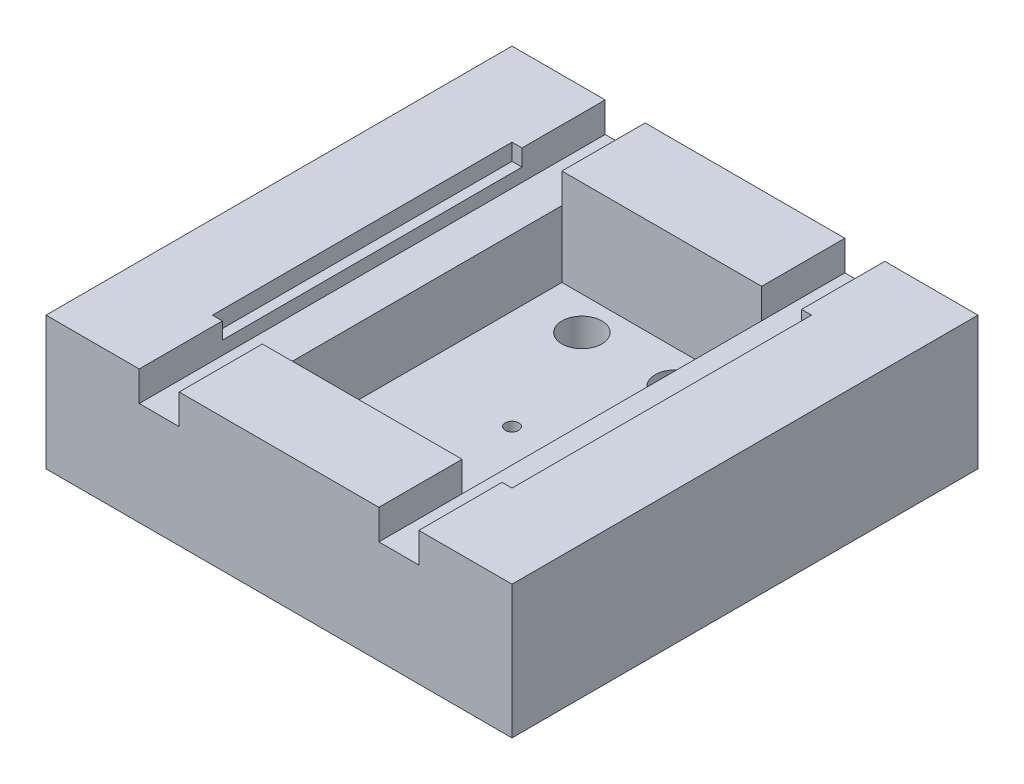
ISO-10303-21;
HEADER;
FILE_DESCRIPTION(('STEP AP214'),'2;1');
FILE_NAME('part.step','',(''),(''),'','','');
FILE_SCHEMA(('AUTOMOTIVE_DESIGN { 1 0 10303 214 1 1 1 1 }'));
ENDSEC;
DATA;
#1=APPLICATION_CONTEXT('core data for automotive mechanical design processes');
#2=APPLICATION_PROTOCOL_DEFINITION('international standard','automotive_design',2000,#1);
#3=PRODUCT_CONTEXT('',#1,'mechanical');
#4=PRODUCT('Part','Part','',(#3));
#5=PRODUCT_RELATED_PRODUCT_CATEGORY('part','',(#4));
#6=PRODUCT_DEFINITION_FORMATION('','',#4);
#7=PRODUCT_DEFINITION_CONTEXT('part definition',#1,'design');
#8=PRODUCT_DEFINITION('design','',#6,#7);
#9=PRODUCT_DEFINITION_SHAPE('','',#8);
#10=(LENGTH_UNIT() NAMED_UNIT(*) SI_UNIT(.MILLI.,.METRE.));
#11=(NAMED_UNIT(*) PLANE_ANGLE_UNIT() SI_UNIT($,.RADIAN.));
#12=(NAMED_UNIT(*) SI_UNIT($,.STERADIAN.) SOLID_ANGLE_UNIT());
#13=UNCERTAINTY_MEASURE_WITH_UNIT(LENGTH_MEASURE(1.E-05),#10,'distance_accuracy_value','');
#14=(GEOMETRIC_REPRESENTATION_CONTEXT(3) GLOBAL_UNCERTAINTY_ASSIGNED_CONTEXT((#13)) GLOBAL_UNIT_ASSIGNED_CONTEXT((#10,
#11,#12)) REPRESENTATION_CONTEXT('',''));
#15=CARTESIAN_POINT('',(0.,0.,0.));
#16=DIRECTION('',(0.,0.,1.));
#17=DIRECTION('',(1.,0.,0.));
#18=AXIS2_PLACEMENT_3D('',#15,#16,#17);
#19=CARTESIAN_POINT('',(20.,30.,0.));
#20=DIRECTION('',(-1.,0.,0.));
#21=DIRECTION('',(0.,0.,1.));
#22=AXIS2_PLACEMENT_3D('',#19,#20,#21);
#23=PLANE('',#22);
#24=DIRECTION('',(0.,0.,-1.));
#25=VECTOR('',#24,1.);
#26=CARTESIAN_POINT('',(20.,15.5,0.));
#27=LINE('',#26,#25);
#28=CARTESIAN_POINT('',(20.,15.5,-57.5));
#29=VERTEX_POINT('',#28);
#30=CARTESIAN_POINT('',(20.,15.5,-70.));
#31=VERTEX_POINT('',#30);
#32=EDGE_CURVE('E241',#29,#31,#27,.T.);
#33=ORIENTED_EDGE('',*,*,#32,.F.);
#34=DIRECTION('',(0.,1.,0.));
#35=VECTOR('',#34,1.);
#36=CARTESIAN_POINT('',(20.,17.5,-57.5));
#37=LINE('',#36,#35);
#38=CARTESIAN_POINT('',(20.,20.,-57.5));
#39=VERTEX_POINT('',#38);
#40=EDGE_CURVE('E302',#29,#39,#37,.T.);
#41=ORIENTED_EDGE('',*,*,#40,.T.);
#42=DIRECTION('',(0.,0.,-1.));
#43=VECTOR('',#42,1.);
#44=CARTESIAN_POINT('',(20.,20.,0.));
#45=LINE('',#44,#43);
#46=CARTESIAN_POINT('',(20.,20.,-70.));
#47=VERTEX_POINT('',#46);
#48=EDGE_CURVE('E304',#39,#47,#45,.T.);
#49=ORIENTED_EDGE('',*,*,#48,.T.);
#50=DIRECTION('',(0.,-1.,0.));
#51=VECTOR('',#50,1.);
#52=CARTESIAN_POINT('',(20.,30.,-70.));
#53=LINE('',#52,#51);
#54=EDGE_CURVE('E291',#47,#31,#53,.T.);
#55=ORIENTED_EDGE('',*,*,#54,.T.);
#56=EDGE_LOOP('',(#33,#41,#49,#55));
#57=FACE_BOUND('',#56,.T.);
#58=ADVANCED_FACE('F33',(#57),#23,.T.);
#59=CARTESIAN_POINT('',(50.,30.,0.));
#60=DIRECTION('',(1.,0.,0.));
#61=DIRECTION('',(0.,0.,-1.));
#62=AXIS2_PLACEMENT_3D('',#59,#60,#61);
#63=PLANE('',#62);
#64=DIRECTION('',(0.,-1.,0.));
#65=VECTOR('',#64,1.);
#66=CARTESIAN_POINT('',(50.,17.5,-57.5));
#67=LINE('',#66,#65);
#68=CARTESIAN_POINT('',(50.,20.,-57.5));
#69=VERTEX_POINT('',#68);
#70=CARTESIAN_POINT('',(50.,15.5,-57.5));
#71=VERTEX_POINT('',#70);
#72=EDGE_CURVE('E314',#69,#71,#67,.T.);
#73=ORIENTED_EDGE('',*,*,#72,.T.);
#74=DIRECTION('',(0.,0.,1.));
#75=VECTOR('',#74,1.);
#76=CARTESIAN_POINT('',(50.,15.5,0.));
#77=LINE('',#76,#75);
#78=CARTESIAN_POINT('',(50.,15.5,-70.));
#79=VERTEX_POINT('',#78);
#80=EDGE_CURVE('E246',#79,#71,#77,.T.);
#81=ORIENTED_EDGE('',*,*,#80,.F.);
#82=DIRECTION('',(0.,-1.,0.));
#83=VECTOR('',#82,1.);
#84=CARTESIAN_POINT('',(50.,30.,-70.));
#85=LINE('',#84,#83);
#86=CARTESIAN_POINT('',(50.,20.,-70.));
#87=VERTEX_POINT('',#86);
#88=EDGE_CURVE('E260',#87,#79,#85,.T.);
#89=ORIENTED_EDGE('',*,*,#88,.F.);
#90=DIRECTION('',(0.,0.,1.));
#91=VECTOR('',#90,1.);
#92=CARTESIAN_POINT('',(50.,20.,0.));
#93=LINE('',#92,#91);
#94=EDGE_CURVE('E318',#87,#69,#93,.T.);
#95=ORIENTED_EDGE('',*,*,#94,.T.);
#96=EDGE_LOOP('',(#73,#81,#89,#95));
#97=FACE_BOUND('',#96,.T.);
#98=ADVANCED_FACE('F438',(#97),#63,.T.);
#99=CARTESIAN_POINT('',(0.,20.,0.));
#100=DIRECTION('',(0.,0.,-1.));
#101=DIRECTION('',(-1.,0.,0.));
#102=AXIS2_PLACEMENT_3D('',#99,#100,#101);
#103=PLANE('',#102);
#104=DIRECTION('',(0.,-1.,0.));
#105=VECTOR('',#104,1.);
#106=CARTESIAN_POINT('',(50.,30.,0.));
#107=LINE('',#106,#105);
#108=CARTESIAN_POINT('',(50.,20.,0.));
#109=VERTEX_POINT('',#108);
#110=CARTESIAN_POINT('',(50.,15.5,0.));
#111=VERTEX_POINT('',#110);
#112=EDGE_CURVE('E268',#109,#111,#107,.T.);
#113=ORIENTED_EDGE('',*,*,#112,.F.);
#114=DIRECTION('',(1.,0.,0.));
#115=VECTOR('',#114,1.);
#116=CARTESIAN_POINT('',(0.,20.,0.));
#117=LINE('',#116,#115);
#118=CARTESIAN_POINT('',(20.,20.,0.));
#119=VERTEX_POINT('',#118);
#120=EDGE_CURVE('E369',#119,#109,#117,.T.);
#121=ORIENTED_EDGE('',*,*,#120,.F.);
#122=DIRECTION('',(0.,-1.,0.));
#123=VECTOR('',#122,1.);
#124=CARTESIAN_POINT('',(20.,30.,0.));
#125=LINE('',#124,#123);
#126=CARTESIAN_POINT('',(20.,15.5,0.));
#127=VERTEX_POINT('',#126);
#128=EDGE_CURVE('E283',#119,#127,#125,.T.);
#129=ORIENTED_EDGE('',*,*,#128,.T.);
#130=DIRECTION('',(1.,0.,0.));
#131=VECTOR('',#130,1.);
#132=CARTESIAN_POINT('',(20.,15.5,0.));
#133=LINE('',#132,#131);
#134=CARTESIAN_POINT('',(14.,15.5,0.));
#135=VERTEX_POINT('',#134);
#136=EDGE_CURVE('E280',#135,#127,#133,.T.);
#137=ORIENTED_EDGE('',*,*,#136,.F.);
#138=DIRECTION('',(0.,-1.,0.));
#139=VECTOR('',#138,1.);
#140=CARTESIAN_POINT('',(14.,30.,0.));
#141=LINE('',#140,#139);
#142=CARTESIAN_POINT('',(14.,20.,0.));
#143=VERTEX_POINT('',#142);
#144=EDGE_CURVE('E286',#143,#135,#141,.T.);
#145=ORIENTED_EDGE('',*,*,#144,.F.);
#146=CARTESIAN_POINT('',(0.,20.,0.));
#147=VERTEX_POINT('',#146);
#148=EDGE_CURVE('E365',#147,#143,#117,.T.);
#149=ORIENTED_EDGE('',*,*,#148,.F.);
#150=DIRECTION('',(0.,-1.,0.));
#151=VECTOR('',#150,1.);
#152=CARTESIAN_POINT('',(0.,20.,0.));
#153=LINE('',#152,#151);
#154=CARTESIAN_POINT('',(0.,0.,0.));
#155=VERTEX_POINT('',#154);
#156=EDGE_CURVE('E392',#147,#155,#153,.T.);
#157=ORIENTED_EDGE('',*,*,#156,.T.);
#158=DIRECTION('',(1.,0.,0.));
#159=VECTOR('',#158,1.);
#160=CARTESIAN_POINT('',(0.,0.,0.));
#161=LINE('',#160,#159);
#162=CARTESIAN_POINT('',(70.,0.,0.));
#163=VERTEX_POINT('',#162);
#164=EDGE_CURVE('E379',#155,#163,#161,.T.);
#165=ORIENTED_EDGE('',*,*,#164,.T.);
#166=DIRECTION('',(0.,-1.,0.));
#167=VECTOR('',#166,1.);
#168=CARTESIAN_POINT('',(70.,20.,0.));
#169=LINE('',#168,#167);
#170=CARTESIAN_POINT('',(70.,20.,0.));
#171=VERTEX_POINT('',#170);
#172=EDGE_CURVE('E389',#171,#163,#169,.T.);
#173=ORIENTED_EDGE('',*,*,#172,.F.);
#174=CARTESIAN_POINT('',(56.,20.,0.));
#175=VERTEX_POINT('',#174);
#176=EDGE_CURVE('E363',#175,#171,#117,.T.);
#177=ORIENTED_EDGE('',*,*,#176,.F.);
#178=DIRECTION('',(0.,-1.,0.));
#179=VECTOR('',#178,1.);
#180=CARTESIAN_POINT('',(56.,30.,0.));
#181=LINE('',#180,#179);
#182=CARTESIAN_POINT('',(56.,15.5,0.));
#183=VERTEX_POINT('',#182);
#184=EDGE_CURVE('E265',#175,#183,#181,.T.);
#185=ORIENTED_EDGE('',*,*,#184,.T.);
#186=DIRECTION('',(1.,0.,0.));
#187=VECTOR('',#186,1.);
#188=CARTESIAN_POINT('',(50.,15.5,0.));
#189=LINE('',#188,#187);
#190=EDGE_CURVE('E249',#111,#183,#189,.T.);
#191=ORIENTED_EDGE('',*,*,#190,.F.);
#192=EDGE_LOOP('',(#113,#121,#129,#137,#145,#149,#157,#165,#173,#177,#185,#191));
#193=FACE_BOUND('',#192,.T.);
#194=ADVANCED_FACE('F423',(#193),#103,.F.);
#195=CARTESIAN_POINT('',(0.,20.,-70.));
#196=DIRECTION('',(0.,0.,1.));
#197=DIRECTION('',(1.,0.,0.));
#198=AXIS2_PLACEMENT_3D('',#195,#196,#197);
#199=PLANE('',#198);
#200=ORIENTED_EDGE('',*,*,#88,.T.);
#201=DIRECTION('',(-1.,0.,0.));
#202=VECTOR('',#201,1.);
#203=CARTESIAN_POINT('',(50.,15.5,-70.));
#204=LINE('',#203,#202);
#205=CARTESIAN_POINT('',(56.,15.5,-70.));
#206=VERTEX_POINT('',#205);
#207=EDGE_CURVE('E257',#206,#79,#204,.T.);
#208=ORIENTED_EDGE('',*,*,#207,.F.);
#209=DIRECTION('',(0.,-1.,0.));
#210=VECTOR('',#209,1.);
#211=CARTESIAN_POINT('',(56.,30.,-70.));
#212=LINE('',#211,#210);
#213=CARTESIAN_POINT('',(56.,20.,-70.));
#214=VERTEX_POINT('',#213);
#215=EDGE_CURVE('E263',#214,#206,#212,.T.);
#216=ORIENTED_EDGE('',*,*,#215,.F.);
#217=DIRECTION('',(-1.,0.,0.));
#218=VECTOR('',#217,1.);
#219=CARTESIAN_POINT('',(0.,20.,-70.));
#220=LINE('',#219,#218);
#221=CARTESIAN_POINT('',(70.,20.,-70.));
#222=VERTEX_POINT('',#221);
#223=EDGE_CURVE('E372',#222,#214,#220,.T.);
#224=ORIENTED_EDGE('',*,*,#223,.F.);
#225=DIRECTION('',(0.,-1.,0.));
#226=VECTOR('',#225,1.);
#227=CARTESIAN_POINT('',(70.,20.,-70.));
#228=LINE('',#227,#226);
#229=CARTESIAN_POINT('',(70.,0.,-70.));
#230=VERTEX_POINT('',#229);
#231=EDGE_CURVE('E386',#222,#230,#228,.T.);
#232=ORIENTED_EDGE('',*,*,#231,.T.);
#233=DIRECTION('',(-1.,0.,0.));
#234=VECTOR('',#233,1.);
#235=CARTESIAN_POINT('',(0.,0.,-70.));
#236=LINE('',#235,#234);
#237=CARTESIAN_POINT('',(0.,0.,-70.));
#238=VERTEX_POINT('',#237);
#239=EDGE_CURVE('E364',#230,#238,#236,.T.);
#240=ORIENTED_EDGE('',*,*,#239,.T.);
#241=DIRECTION('',(0.,-1.,0.));
#242=VECTOR('',#241,1.);
#243=CARTESIAN_POINT('',(0.,20.,-70.));
#244=LINE('',#243,#242);
#245=CARTESIAN_POINT('',(0.,20.,-70.));
#246=VERTEX_POINT('',#245);
#247=EDGE_CURVE('E375',#246,#238,#244,.T.);
#248=ORIENTED_EDGE('',*,*,#247,.F.);
#249=CARTESIAN_POINT('',(14.,20.,-70.));
#250=VERTEX_POINT('',#249);
#251=EDGE_CURVE('E371',#250,#246,#220,.T.);
#252=ORIENTED_EDGE('',*,*,#251,.F.);
#253=DIRECTION('',(0.,-1.,0.));
#254=VECTOR('',#253,1.);
#255=CARTESIAN_POINT('',(14.,30.,-70.));
#256=LINE('',#255,#254);
#257=CARTESIAN_POINT('',(14.,15.5,-70.));
#258=VERTEX_POINT('',#257);
#259=EDGE_CURVE('E288',#250,#258,#256,.T.);
#260=ORIENTED_EDGE('',*,*,#259,.T.);
#261=DIRECTION('',(-1.,0.,0.));
#262=VECTOR('',#261,1.);
#263=CARTESIAN_POINT('',(20.,15.5,-70.));
#264=LINE('',#263,#262);
#265=EDGE_CURVE('E274',#31,#258,#264,.T.);
#266=ORIENTED_EDGE('',*,*,#265,.F.);
#267=ORIENTED_EDGE('',*,*,#54,.F.);
#268=EDGE_CURVE('E376',#87,#47,#220,.T.);
#269=ORIENTED_EDGE('',*,*,#268,.F.);
#270=EDGE_LOOP('',(#200,#208,#216,#224,#232,#240,#248,#252,#260,#266,#267,#269));
#271=FACE_BOUND('',#270,.T.);
#272=ADVANCED_FACE('F432',(#271),#199,.F.);
#273=CARTESIAN_POINT('',(0.,20.,0.));
#274=DIRECTION('',(0.,-1.,0.));
#275=DIRECTION('',(0.,0.,-1.));
#276=AXIS2_PLACEMENT_3D('',#273,#274,#275);
#277=PLANE('',#276);
#278=ORIENTED_EDGE('',*,*,#94,.F.);
#279=ORIENTED_EDGE('',*,*,#268,.T.);
#280=ORIENTED_EDGE('',*,*,#48,.F.);
#281=DIRECTION('',(-1.,0.,0.));
#282=VECTOR('',#281,1.);
#283=CARTESIAN_POINT('',(57.5,20.,-57.5));
#284=LINE('',#283,#282);
#285=EDGE_CURVE('E338',#69,#39,#284,.T.);
#286=ORIENTED_EDGE('',*,*,#285,.F.);
#287=EDGE_LOOP('',(#278,#279,#280,#286));
#288=FACE_BOUND('',#287,.T.);
#289=ADVANCED_FACE('F447',(#288),#277,.F.);
#290=CARTESIAN_POINT('',(50.,20.,-12.5));
#291=VERTEX_POINT('',#290);
#292=EDGE_CURVE('E316',#291,#109,#93,.T.);
#293=ORIENTED_EDGE('',*,*,#292,.F.);
#294=DIRECTION('',(1.,0.,0.));
#295=VECTOR('',#294,1.);
#296=CARTESIAN_POINT('',(12.5,20.,-12.5));
#297=LINE('',#296,#295);
#298=CARTESIAN_POINT('',(20.,20.,-12.5));
#299=VERTEX_POINT('',#298);
#300=EDGE_CURVE('E347',#299,#291,#297,.T.);
#301=ORIENTED_EDGE('',*,*,#300,.F.);
#302=EDGE_CURVE('E306',#119,#299,#45,.T.);
#303=ORIENTED_EDGE('',*,*,#302,.F.);
#304=ORIENTED_EDGE('',*,*,#120,.T.);
#305=EDGE_LOOP('',(#293,#301,#303,#304));
#306=FACE_BOUND('',#305,.T.);
#307=ADVANCED_FACE('F478',(#306),#277,.F.);
#308=DIRECTION('',(0.,0.,-1.));
#309=VECTOR('',#308,1.);
#310=CARTESIAN_POINT('',(56.,20.,0.));
#311=LINE('',#310,#309);
#312=CARTESIAN_POINT('',(56.,20.,-12.5));
#313=VERTEX_POINT('',#312);
#314=EDGE_CURVE('E312',#175,#313,#311,.T.);
#315=ORIENTED_EDGE('',*,*,#314,.F.);
#316=ORIENTED_EDGE('',*,*,#176,.T.);
#317=DIRECTION('',(0.,0.,-1.));
#318=VECTOR('',#317,1.);
#319=CARTESIAN_POINT('',(70.,20.,0.));
#320=LINE('',#319,#318);
#321=EDGE_CURVE('E368',#171,#222,#320,.T.);
#322=ORIENTED_EDGE('',*,*,#321,.T.);
#323=ORIENTED_EDGE('',*,*,#223,.T.);
#324=CARTESIAN_POINT('',(56.,20.,-57.5));
#325=VERTEX_POINT('',#324);
#326=EDGE_CURVE('E310',#325,#214,#311,.T.);
#327=ORIENTED_EDGE('',*,*,#326,.F.);
#328=CARTESIAN_POINT('',(57.5,20.,-57.5));
#329=VERTEX_POINT('',#328);
#330=EDGE_CURVE('E334',#329,#325,#284,.T.);
#331=ORIENTED_EDGE('',*,*,#330,.F.);
#332=DIRECTION('',(0.,0.,-1.));
#333=VECTOR('',#332,1.);
#334=CARTESIAN_POINT('',(57.5,20.,-12.5));
#335=LINE('',#334,#333);
#336=CARTESIAN_POINT('',(57.5,20.,-12.5));
#337=VERTEX_POINT('',#336);
#338=EDGE_CURVE('E346',#337,#329,#335,.T.);
#339=ORIENTED_EDGE('',*,*,#338,.F.);
#340=EDGE_CURVE('E342',#313,#337,#297,.T.);
#341=ORIENTED_EDGE('',*,*,#340,.F.);
#342=EDGE_LOOP('',(#315,#316,#322,#323,#327,#331,#339,#341));
#343=FACE_BOUND('',#342,.T.);
#344=ADVANCED_FACE('F462',(#343),#277,.F.);
#345=DIRECTION('',(0.,0.,1.));
#346=VECTOR('',#345,1.);
#347=CARTESIAN_POINT('',(14.,20.,0.));
#348=LINE('',#347,#346);
#349=CARTESIAN_POINT('',(14.,20.,-57.5));
#350=VERTEX_POINT('',#349);
#351=EDGE_CURVE('E299',#250,#350,#348,.T.);
#352=ORIENTED_EDGE('',*,*,#351,.F.);
#353=ORIENTED_EDGE('',*,*,#251,.T.);
#354=DIRECTION('',(0.,0.,1.));
#355=VECTOR('',#354,1.);
#356=CARTESIAN_POINT('',(0.,20.,0.));
#357=LINE('',#356,#355);
#358=EDGE_CURVE('E360',#246,#147,#357,.T.);
#359=ORIENTED_EDGE('',*,*,#358,.T.);
#360=ORIENTED_EDGE('',*,*,#148,.T.);
#361=CARTESIAN_POINT('',(14.,20.,-12.5));
#362=VERTEX_POINT('',#361);
#363=EDGE_CURVE('E297',#362,#143,#348,.T.);
#364=ORIENTED_EDGE('',*,*,#363,.F.);
#365=CARTESIAN_POINT('',(12.5,20.,-12.5));
#366=VERTEX_POINT('',#365);
#367=EDGE_CURVE('E343',#366,#362,#297,.T.);
#368=ORIENTED_EDGE('',*,*,#367,.F.);
#369=DIRECTION('',(0.,0.,1.));
#370=VECTOR('',#369,1.);
#371=CARTESIAN_POINT('',(12.5,20.,-57.5));
#372=LINE('',#371,#370);
#373=CARTESIAN_POINT('',(12.5,20.,-57.5));
#374=VERTEX_POINT('',#373);
#375=EDGE_CURVE('E337',#374,#366,#372,.T.);
#376=ORIENTED_EDGE('',*,*,#375,.F.);
#377=EDGE_CURVE('E339',#350,#374,#284,.T.);
#378=ORIENTED_EDGE('',*,*,#377,.F.);
#379=EDGE_LOOP('',(#352,#353,#359,#360,#364,#368,#376,#378));
#380=FACE_BOUND('',#379,.T.);
#381=ADVANCED_FACE('F418',(#380),#277,.F.);
#382=CARTESIAN_POINT('',(57.5,17.5,-57.5));
#383=DIRECTION('',(0.,0.,-1.));
#384=DIRECTION('',(-1.,0.,0.));
#385=AXIS2_PLACEMENT_3D('',#382,#383,#384);
#386=PLANE('',#385);
#387=ORIENTED_EDGE('',*,*,#72,.F.);
#388=ORIENTED_EDGE('',*,*,#285,.T.);
#389=ORIENTED_EDGE('',*,*,#40,.F.);
#390=DIRECTION('',(0.,1.,0.));
#391=VECTOR('',#390,1.);
#392=CARTESIAN_POINT('',(20.,5.5,-57.5));
#393=LINE('',#392,#391);
#394=CARTESIAN_POINT('',(20.,5.5,-57.5));
#395=VERTEX_POINT('',#394);
#396=EDGE_CURVE('E239',#395,#29,#393,.T.);
#397=ORIENTED_EDGE('',*,*,#396,.F.);
#398=DIRECTION('',(-1.,0.,0.));
#399=VECTOR('',#398,1.);
#400=CARTESIAN_POINT('',(50.,5.5,-57.5));
#401=LINE('',#400,#399);
#402=CARTESIAN_POINT('',(50.,5.5,-57.5));
#403=VERTEX_POINT('',#402);
#404=EDGE_CURVE('E218',#403,#395,#401,.T.);
#405=ORIENTED_EDGE('',*,*,#404,.F.);
#406=DIRECTION('',(0.,1.,0.));
#407=VECTOR('',#406,1.);
#408=CARTESIAN_POINT('',(50.,5.5,-57.5));
#409=LINE('',#408,#407);
#410=EDGE_CURVE('E242',#403,#71,#409,.T.);
#411=ORIENTED_EDGE('',*,*,#410,.T.);
#412=EDGE_LOOP('',(#387,#388,#389,#397,#405,#411));
#413=FACE_BOUND('',#412,.T.);
#414=ADVANCED_FACE('F445',(#413),#386,.F.);
#415=DIRECTION('',(0.,1.,0.));
#416=VECTOR('',#415,1.);
#417=CARTESIAN_POINT('',(56.,17.5,-57.5));
#418=LINE('',#417,#416);
#419=CARTESIAN_POINT('',(56.,17.5,-57.5));
#420=VERTEX_POINT('',#419);
#421=EDGE_CURVE('E308',#420,#325,#418,.T.);
#422=ORIENTED_EDGE('',*,*,#421,.F.);
#423=DIRECTION('',(-1.,0.,0.));
#424=VECTOR('',#423,1.);
#425=CARTESIAN_POINT('',(57.5,17.5,-57.5));
#426=LINE('',#425,#424);
#427=CARTESIAN_POINT('',(57.5,17.5,-57.5));
#428=VERTEX_POINT('',#427);
#429=EDGE_CURVE('E319',#428,#420,#426,.T.);
#430=ORIENTED_EDGE('',*,*,#429,.F.);
#431=DIRECTION('',(0.,1.,0.));
#432=VECTOR('',#431,1.);
#433=CARTESIAN_POINT('',(57.5,17.5,-57.5));
#434=LINE('',#433,#432);
#435=EDGE_CURVE('E350',#428,#329,#434,.T.);
#436=ORIENTED_EDGE('',*,*,#435,.T.);
#437=ORIENTED_EDGE('',*,*,#330,.T.);
#438=EDGE_LOOP('',(#422,#430,#436,#437));
#439=FACE_BOUND('',#438,.T.);
#440=ADVANCED_FACE('F465',(#439),#386,.F.);
#441=DIRECTION('',(0.,-1.,0.));
#442=VECTOR('',#441,1.);
#443=CARTESIAN_POINT('',(14.,17.5,-57.5));
#444=LINE('',#443,#442);
#445=CARTESIAN_POINT('',(14.,17.5,-57.5));
#446=VERTEX_POINT('',#445);
#447=EDGE_CURVE('E295',#350,#446,#444,.T.);
#448=ORIENTED_EDGE('',*,*,#447,.F.);
#449=ORIENTED_EDGE('',*,*,#377,.T.);
#450=DIRECTION('',(0.,1.,0.));
#451=VECTOR('',#450,1.);
#452=CARTESIAN_POINT('',(12.5,17.5,-57.5));
#453=LINE('',#452,#451);
#454=CARTESIAN_POINT('',(12.5,17.5,-57.5));
#455=VERTEX_POINT('',#454);
#456=EDGE_CURVE('E333',#455,#374,#453,.T.);
#457=ORIENTED_EDGE('',*,*,#456,.F.);
#458=EDGE_CURVE('E323',#446,#455,#426,.T.);
#459=ORIENTED_EDGE('',*,*,#458,.F.);
#460=EDGE_LOOP('',(#448,#449,#457,#459));
#461=FACE_BOUND('',#460,.T.);
#462=ADVANCED_FACE('F404',(#461),#386,.F.);
#463=CARTESIAN_POINT('',(12.5,17.5,-12.5));
#464=DIRECTION('',(0.,0.,1.));
#465=DIRECTION('',(1.,0.,0.));
#466=AXIS2_PLACEMENT_3D('',#463,#464,#465);
#467=PLANE('',#466);
#468=DIRECTION('',(0.,1.,0.));
#469=VECTOR('',#468,1.);
#470=CARTESIAN_POINT('',(50.,17.5,-12.5));
#471=LINE('',#470,#469);
#472=CARTESIAN_POINT('',(50.,15.5,-12.5));
#473=VERTEX_POINT('',#472);
#474=EDGE_CURVE('E48',#473,#291,#471,.T.);
#475=ORIENTED_EDGE('',*,*,#474,.F.);
#476=DIRECTION('',(0.,1.,0.));
#477=VECTOR('',#476,1.);
#478=CARTESIAN_POINT('',(50.,5.5,-12.5));
#479=LINE('',#478,#477);
#480=CARTESIAN_POINT('',(50.,5.5,-12.5));
#481=VERTEX_POINT('',#480);
#482=EDGE_CURVE('E217',#481,#473,#479,.T.);
#483=ORIENTED_EDGE('',*,*,#482,.F.);
#484=DIRECTION('',(1.,0.,0.));
#485=VECTOR('',#484,1.);
#486=CARTESIAN_POINT('',(20.,5.5,-12.5));
#487=LINE('',#486,#485);
#488=CARTESIAN_POINT('',(20.,5.5,-12.5));
#489=VERTEX_POINT('',#488);
#490=EDGE_CURVE('E221',#489,#481,#487,.T.);
#491=ORIENTED_EDGE('',*,*,#490,.F.);
#492=DIRECTION('',(0.,1.,0.));
#493=VECTOR('',#492,1.);
#494=CARTESIAN_POINT('',(20.,5.5,-12.5));
#495=LINE('',#494,#493);
#496=CARTESIAN_POINT('',(20.,15.5,-12.5));
#497=VERTEX_POINT('',#496);
#498=EDGE_CURVE('E206',#489,#497,#495,.T.);
#499=ORIENTED_EDGE('',*,*,#498,.T.);
#500=DIRECTION('',(0.,-1.,0.));
#501=VECTOR('',#500,1.);
#502=CARTESIAN_POINT('',(20.,17.5,-12.5));
#503=LINE('',#502,#501);
#504=EDGE_CURVE('E300',#299,#497,#503,.T.);
#505=ORIENTED_EDGE('',*,*,#504,.F.);
#506=ORIENTED_EDGE('',*,*,#300,.T.);
#507=EDGE_LOOP('',(#475,#483,#491,#499,#505,#506));
#508=FACE_BOUND('',#507,.T.);
#509=ADVANCED_FACE('F222',(#508),#467,.F.);
#510=DIRECTION('',(0.,-1.,0.));
#511=VECTOR('',#510,1.);
#512=CARTESIAN_POINT('',(56.,17.5,-12.5));
#513=LINE('',#512,#511);
#514=CARTESIAN_POINT('',(56.,17.5,-12.5));
#515=VERTEX_POINT('',#514);
#516=EDGE_CURVE('E56',#313,#515,#513,.T.);
#517=ORIENTED_EDGE('',*,*,#516,.F.);
#518=ORIENTED_EDGE('',*,*,#340,.T.);
#519=DIRECTION('',(0.,1.,0.));
#520=VECTOR('',#519,1.);
#521=CARTESIAN_POINT('',(57.5,17.5,-12.5));
#522=LINE('',#521,#520);
#523=CARTESIAN_POINT('',(57.5,17.5,-12.5));
#524=VERTEX_POINT('',#523);
#525=EDGE_CURVE('E353',#524,#337,#522,.T.);
#526=ORIENTED_EDGE('',*,*,#525,.F.);
#527=DIRECTION('',(1.,0.,0.));
#528=VECTOR('',#527,1.);
#529=CARTESIAN_POINT('',(12.5,17.5,-12.5));
#530=LINE('',#529,#528);
#531=EDGE_CURVE('E326',#515,#524,#530,.T.);
#532=ORIENTED_EDGE('',*,*,#531,.F.);
#533=EDGE_LOOP('',(#517,#518,#526,#532));
#534=FACE_BOUND('',#533,.T.);
#535=ADVANCED_FACE('F581',(#534),#467,.F.);
#536=DIRECTION('',(0.,1.,0.));
#537=VECTOR('',#536,1.);
#538=CARTESIAN_POINT('',(14.,17.5,-12.5));
#539=LINE('',#538,#537);
#540=CARTESIAN_POINT('',(14.,17.5,-12.5));
#541=VERTEX_POINT('',#540);
#542=EDGE_CURVE('E271',#541,#362,#539,.T.);
#543=ORIENTED_EDGE('',*,*,#542,.F.);
#544=CARTESIAN_POINT('',(12.5,17.5,-12.5));
#545=VERTEX_POINT('',#544);
#546=EDGE_CURVE('E327',#545,#541,#530,.T.);
#547=ORIENTED_EDGE('',*,*,#546,.F.);
#548=DIRECTION('',(0.,1.,0.));
#549=VECTOR('',#548,1.);
#550=CARTESIAN_POINT('',(12.5,17.5,-12.5));
#551=LINE('',#550,#549);
#552=EDGE_CURVE('E356',#545,#366,#551,.T.);
#553=ORIENTED_EDGE('',*,*,#552,.T.);
#554=ORIENTED_EDGE('',*,*,#367,.T.);
#555=EDGE_LOOP('',(#543,#547,#553,#554));
#556=FACE_BOUND('',#555,.T.);
#557=ADVANCED_FACE('F412',(#556),#467,.F.);
#558=CARTESIAN_POINT('',(0.,17.5,0.));
#559=DIRECTION('',(0.,1.,0.));
#560=DIRECTION('',(0.,0.,1.));
#561=AXIS2_PLACEMENT_3D('',#558,#559,#560);
#562=PLANE('',#561);
#563=ORIENTED_EDGE('',*,*,#429,.T.);
#564=DIRECTION('',(0.,0.,1.));
#565=VECTOR('',#564,1.);
#566=CARTESIAN_POINT('',(56.,17.5,0.));
#567=LINE('',#566,#565);
#568=EDGE_CURVE('E11',#420,#515,#567,.T.);
#569=ORIENTED_EDGE('',*,*,#568,.T.);
#570=ORIENTED_EDGE('',*,*,#531,.T.);
#571=DIRECTION('',(0.,0.,-1.));
#572=VECTOR('',#571,1.);
#573=CARTESIAN_POINT('',(57.5,17.5,-12.5));
#574=LINE('',#573,#572);
#575=EDGE_CURVE('E330',#524,#428,#574,.T.);
#576=ORIENTED_EDGE('',*,*,#575,.T.);
#577=EDGE_LOOP('',(#563,#569,#570,#576));
#578=FACE_BOUND('',#577,.T.);
#579=ADVANCED_FACE('F501',(#578),#562,.T.);
#580=ORIENTED_EDGE('',*,*,#546,.T.);
#581=DIRECTION('',(0.,0.,-1.));
#582=VECTOR('',#581,1.);
#583=CARTESIAN_POINT('',(14.,17.5,0.));
#584=LINE('',#583,#582);
#585=EDGE_CURVE('E41',#541,#446,#584,.T.);
#586=ORIENTED_EDGE('',*,*,#585,.T.);
#587=ORIENTED_EDGE('',*,*,#458,.T.);
#588=DIRECTION('',(0.,0.,1.));
#589=VECTOR('',#588,1.);
#590=CARTESIAN_POINT('',(12.5,17.5,-57.5));
#591=LINE('',#590,#589);
#592=EDGE_CURVE('E322',#455,#545,#591,.T.);
#593=ORIENTED_EDGE('',*,*,#592,.T.);
#594=EDGE_LOOP('',(#580,#586,#587,#593));
#595=FACE_BOUND('',#594,.T.);
#596=ADVANCED_FACE('F397',(#595),#562,.T.);
#597=CARTESIAN_POINT('',(0.,20.,0.));
#598=DIRECTION('',(1.,0.,0.));
#599=DIRECTION('',(0.,0.,-1.));
#600=AXIS2_PLACEMENT_3D('',#597,#598,#599);
#601=PLANE('',#600);
#602=DIRECTION('',(0.,0.,1.));
#603=VECTOR('',#602,1.);
#604=CARTESIAN_POINT('',(0.,0.,0.));
#605=LINE('',#604,#603);
#606=EDGE_CURVE('E352',#238,#155,#605,.T.);
#607=ORIENTED_EDGE('',*,*,#606,.T.);
#608=ORIENTED_EDGE('',*,*,#156,.F.);
#609=ORIENTED_EDGE('',*,*,#358,.F.);
#610=ORIENTED_EDGE('',*,*,#247,.T.);
#611=EDGE_LOOP('',(#607,#608,#609,#610));
#612=FACE_BOUND('',#611,.T.);
#613=ADVANCED_FACE('F35',(#612),#601,.F.);
#614=CARTESIAN_POINT('',(70.,20.,0.));
#615=DIRECTION('',(-1.,0.,0.));
#616=DIRECTION('',(0.,0.,1.));
#617=AXIS2_PLACEMENT_3D('',#614,#615,#616);
#618=PLANE('',#617);
#619=DIRECTION('',(0.,0.,-1.));
#620=VECTOR('',#619,1.);
#621=CARTESIAN_POINT('',(70.,0.,0.));
#622=LINE('',#621,#620);
#623=EDGE_CURVE('E381',#163,#230,#622,.T.);
#624=ORIENTED_EDGE('',*,*,#623,.T.);
#625=ORIENTED_EDGE('',*,*,#231,.F.);
#626=ORIENTED_EDGE('',*,*,#321,.F.);
#627=ORIENTED_EDGE('',*,*,#172,.T.);
#628=EDGE_LOOP('',(#624,#625,#626,#627));
#629=FACE_BOUND('',#628,.T.);
#630=ADVANCED_FACE('F488',(#629),#618,.F.);
#631=CARTESIAN_POINT('',(0.,0.,0.));
#632=DIRECTION('',(0.,-1.,0.));
#633=DIRECTION('',(0.,0.,-1.));
#634=AXIS2_PLACEMENT_3D('',#631,#632,#633);
#635=PLANE('',#634);
#636=CARTESIAN_POINT('',(35.,0.,-35.));
#637=DIRECTION('',(0.,-1.,0.));
#638=DIRECTION('',(0.,0.,-1.));
#639=AXIS2_PLACEMENT_3D('',#636,#637,#638);
#640=CIRCLE('',#639,0.999999999999998);
#641=CARTESIAN_POINT('',(35.,0.,-36.));
#642=VERTEX_POINT('',#641);
#643=EDGE_CURVE('E230',#642,#642,#640,.T.);
#644=ORIENTED_EDGE('',*,*,#643,.F.);
#645=EDGE_LOOP('',(#644));
#646=FACE_BOUND('',#645,.T.);
#647=CARTESIAN_POINT('',(28.,0.,-52.5));
#648=DIRECTION('',(0.,-1.,0.));
#649=DIRECTION('',(0.,0.,-1.));
#650=AXIS2_PLACEMENT_3D('',#647,#648,#649);
#651=CIRCLE('',#650,3.);
#652=CARTESIAN_POINT('',(28.,0.,-55.5));
#653=VERTEX_POINT('',#652);
#654=EDGE_CURVE('E233',#653,#653,#651,.T.);
#655=ORIENTED_EDGE('',*,*,#654,.F.);
#656=EDGE_LOOP('',(#655));
#657=FACE_BOUND('',#656,.T.);
#658=CARTESIAN_POINT('',(42.,0.,-52.5));
#659=DIRECTION('',(0.,-1.,0.));
#660=DIRECTION('',(0.,0.,-1.));
#661=AXIS2_PLACEMENT_3D('',#658,#659,#660);
#662=CIRCLE('',#661,3.);
#663=CARTESIAN_POINT('',(42.,0.,-55.5));
#664=VERTEX_POINT('',#663);
#665=EDGE_CURVE('E793',#664,#664,#662,.T.);
#666=ORIENTED_EDGE('',*,*,#665,.F.);
#667=EDGE_LOOP('',(#666));
#668=FACE_BOUND('',#667,.T.);
#669=CARTESIAN_POINT('',(42.,0.,-17.5));
#670=DIRECTION('',(0.,-1.,0.));
#671=DIRECTION('',(0.,0.,-1.));
#672=AXIS2_PLACEMENT_3D('',#669,#670,#671);
#673=CIRCLE('',#672,3.);
#674=CARTESIAN_POINT('',(42.,0.,-20.5));
#675=VERTEX_POINT('',#674);
#676=EDGE_CURVE('E790',#675,#675,#673,.T.);
#677=ORIENTED_EDGE('',*,*,#676,.F.);
#678=EDGE_LOOP('',(#677));
#679=FACE_BOUND('',#678,.T.);
#680=CARTESIAN_POINT('',(28.,0.,-17.5));
#681=DIRECTION('',(0.,-1.,0.));
#682=DIRECTION('',(0.,0.,-1.));
#683=AXIS2_PLACEMENT_3D('',#680,#681,#682);
#684=CIRCLE('',#683,3.);
#685=CARTESIAN_POINT('',(28.,0.,-20.5));
#686=VERTEX_POINT('',#685);
#687=EDGE_CURVE('E786',#686,#686,#684,.T.);
#688=ORIENTED_EDGE('',*,*,#687,.F.);
#689=EDGE_LOOP('',(#688));
#690=FACE_BOUND('',#689,.T.);
#691=ORIENTED_EDGE('',*,*,#606,.F.);
#692=ORIENTED_EDGE('',*,*,#239,.F.);
#693=ORIENTED_EDGE('',*,*,#623,.F.);
#694=ORIENTED_EDGE('',*,*,#164,.F.);
#695=EDGE_LOOP('',(#691,#692,#693,#694));
#696=FACE_BOUND('',#695,.T.);
#697=ADVANCED_FACE('F493',(#646,#657,#668,#679,#690,#696),#635,.T.);
#698=CARTESIAN_POINT('',(57.5,17.5,-12.5));
#699=DIRECTION('',(1.,0.,0.));
#700=DIRECTION('',(0.,0.,-1.));
#701=AXIS2_PLACEMENT_3D('',#698,#699,#700);
#702=PLANE('',#701);
#703=ORIENTED_EDGE('',*,*,#338,.T.);
#704=ORIENTED_EDGE('',*,*,#435,.F.);
#705=ORIENTED_EDGE('',*,*,#575,.F.);
#706=ORIENTED_EDGE('',*,*,#525,.T.);
#707=EDGE_LOOP('',(#703,#704,#705,#706));
#708=FACE_BOUND('',#707,.T.);
#709=ADVANCED_FACE('F469',(#708),#702,.F.);
#710=CARTESIAN_POINT('',(12.5,17.5,-57.5));
#711=DIRECTION('',(-1.,0.,0.));
#712=DIRECTION('',(0.,0.,1.));
#713=AXIS2_PLACEMENT_3D('',#710,#711,#712);
#714=PLANE('',#713);
#715=ORIENTED_EDGE('',*,*,#375,.T.);
#716=ORIENTED_EDGE('',*,*,#552,.F.);
#717=ORIENTED_EDGE('',*,*,#592,.F.);
#718=ORIENTED_EDGE('',*,*,#456,.T.);
#719=EDGE_LOOP('',(#715,#716,#717,#718));
#720=FACE_BOUND('',#719,.T.);
#721=ADVANCED_FACE('F409',(#720),#714,.F.);
#722=ORIENTED_EDGE('',*,*,#504,.T.);
#723=EDGE_CURVE('E272',#127,#497,#27,.T.);
#724=ORIENTED_EDGE('',*,*,#723,.F.);
#725=ORIENTED_EDGE('',*,*,#128,.F.);
#726=ORIENTED_EDGE('',*,*,#302,.T.);
#727=EDGE_LOOP('',(#722,#724,#725,#726));
#728=FACE_BOUND('',#727,.T.);
#729=ADVANCED_FACE('F505',(#728),#23,.T.);
#730=CARTESIAN_POINT('',(14.,30.,0.));
#731=DIRECTION('',(1.,0.,0.));
#732=DIRECTION('',(0.,0.,-1.));
#733=AXIS2_PLACEMENT_3D('',#730,#731,#732);
#734=PLANE('',#733);
#735=ORIENTED_EDGE('',*,*,#351,.T.);
#736=ORIENTED_EDGE('',*,*,#447,.T.);
#737=ORIENTED_EDGE('',*,*,#585,.F.);
#738=ORIENTED_EDGE('',*,*,#542,.T.);
#739=ORIENTED_EDGE('',*,*,#363,.T.);
#740=ORIENTED_EDGE('',*,*,#144,.T.);
#741=DIRECTION('',(0.,0.,1.));
#742=VECTOR('',#741,1.);
#743=CARTESIAN_POINT('',(14.,15.5,0.));
#744=LINE('',#743,#742);
#745=EDGE_CURVE('E277',#258,#135,#744,.T.);
#746=ORIENTED_EDGE('',*,*,#745,.F.);
#747=ORIENTED_EDGE('',*,*,#259,.F.);
#748=EDGE_LOOP('',(#735,#736,#737,#738,#739,#740,#746,#747));
#749=FACE_BOUND('',#748,.T.);
#750=ADVANCED_FACE('F414',(#749),#734,.T.);
#751=CARTESIAN_POINT('',(0.,15.5,0.));
#752=DIRECTION('',(0.,1.,0.));
#753=DIRECTION('',(0.,0.,1.));
#754=AXIS2_PLACEMENT_3D('',#751,#752,#753);
#755=PLANE('',#754);
#756=ORIENTED_EDGE('',*,*,#723,.T.);
#757=EDGE_CURVE('E214',#497,#29,#27,.T.);
#758=ORIENTED_EDGE('',*,*,#757,.T.);
#759=ORIENTED_EDGE('',*,*,#32,.T.);
#760=ORIENTED_EDGE('',*,*,#265,.T.);
#761=ORIENTED_EDGE('',*,*,#745,.T.);
#762=ORIENTED_EDGE('',*,*,#136,.T.);
#763=EDGE_LOOP('',(#756,#758,#759,#760,#761,#762));
#764=FACE_BOUND('',#763,.T.);
#765=ADVANCED_FACE('F426',(#764),#755,.T.);
#766=EDGE_CURVE('E251',#473,#111,#77,.T.);
#767=ORIENTED_EDGE('',*,*,#766,.F.);
#768=ORIENTED_EDGE('',*,*,#474,.T.);
#769=ORIENTED_EDGE('',*,*,#292,.T.);
#770=ORIENTED_EDGE('',*,*,#112,.T.);
#771=EDGE_LOOP('',(#767,#768,#769,#770));
#772=FACE_BOUND('',#771,.T.);
#773=ADVANCED_FACE('F483',(#772),#63,.T.);
#774=CARTESIAN_POINT('',(56.,30.,0.));
#775=DIRECTION('',(-1.,0.,0.));
#776=DIRECTION('',(0.,0.,1.));
#777=AXIS2_PLACEMENT_3D('',#774,#775,#776);
#778=PLANE('',#777);
#779=ORIENTED_EDGE('',*,*,#314,.T.);
#780=ORIENTED_EDGE('',*,*,#516,.T.);
#781=ORIENTED_EDGE('',*,*,#568,.F.);
#782=ORIENTED_EDGE('',*,*,#421,.T.);
#783=ORIENTED_EDGE('',*,*,#326,.T.);
#784=ORIENTED_EDGE('',*,*,#215,.T.);
#785=DIRECTION('',(0.,0.,-1.));
#786=VECTOR('',#785,1.);
#787=CARTESIAN_POINT('',(56.,15.5,0.));
#788=LINE('',#787,#786);
#789=EDGE_CURVE('E254',#183,#206,#788,.T.);
#790=ORIENTED_EDGE('',*,*,#789,.F.);
#791=ORIENTED_EDGE('',*,*,#184,.F.);
#792=EDGE_LOOP('',(#779,#780,#781,#782,#783,#784,#790,#791));
#793=FACE_BOUND('',#792,.T.);
#794=ADVANCED_FACE('F456',(#793),#778,.T.);
#795=CARTESIAN_POINT('',(0.,15.5,0.));
#796=DIRECTION('',(0.,-1.,0.));
#797=DIRECTION('',(0.,0.,-1.));
#798=AXIS2_PLACEMENT_3D('',#795,#796,#797);
#799=PLANE('',#798);
#800=ORIENTED_EDGE('',*,*,#80,.T.);
#801=EDGE_CURVE('E250',#71,#473,#77,.T.);
#802=ORIENTED_EDGE('',*,*,#801,.T.);
#803=ORIENTED_EDGE('',*,*,#766,.T.);
#804=ORIENTED_EDGE('',*,*,#190,.T.);
#805=ORIENTED_EDGE('',*,*,#789,.T.);
#806=ORIENTED_EDGE('',*,*,#207,.T.);
#807=EDGE_LOOP('',(#800,#802,#803,#804,#805,#806));
#808=FACE_BOUND('',#807,.T.);
#809=ADVANCED_FACE('F453',(#808),#799,.F.);
#810=CARTESIAN_POINT('',(50.,5.5,-12.5));
#811=DIRECTION('',(1.,0.,0.));
#812=DIRECTION('',(0.,0.,-1.));
#813=AXIS2_PLACEMENT_3D('',#810,#811,#812);
#814=PLANE('',#813);
#815=ORIENTED_EDGE('',*,*,#410,.F.);
#816=DIRECTION('',(0.,0.,-1.));
#817=VECTOR('',#816,1.);
#818=CARTESIAN_POINT('',(50.,5.5,-12.5));
#819=LINE('',#818,#817);
#820=EDGE_CURVE('E226',#481,#403,#819,.T.);
#821=ORIENTED_EDGE('',*,*,#820,.F.);
#822=ORIENTED_EDGE('',*,*,#482,.T.);
#823=ORIENTED_EDGE('',*,*,#801,.F.);
#824=EDGE_LOOP('',(#815,#821,#822,#823));
#825=FACE_BOUND('',#824,.T.);
#826=ADVANCED_FACE('F637',(#825),#814,.F.);
#827=CARTESIAN_POINT('',(20.,5.5,-57.5));
#828=DIRECTION('',(-1.,0.,0.));
#829=DIRECTION('',(0.,0.,1.));
#830=AXIS2_PLACEMENT_3D('',#827,#828,#829);
#831=PLANE('',#830);
#832=ORIENTED_EDGE('',*,*,#757,.F.);
#833=ORIENTED_EDGE('',*,*,#498,.F.);
#834=DIRECTION('',(0.,0.,1.));
#835=VECTOR('',#834,1.);
#836=CARTESIAN_POINT('',(20.,5.5,-57.5));
#837=LINE('',#836,#835);
#838=EDGE_CURVE('E211',#395,#489,#837,.T.);
#839=ORIENTED_EDGE('',*,*,#838,.F.);
#840=ORIENTED_EDGE('',*,*,#396,.T.);
#841=EDGE_LOOP('',(#832,#833,#839,#840));
#842=FACE_BOUND('',#841,.T.);
#843=ADVANCED_FACE('F208',(#842),#831,.F.);
#844=CARTESIAN_POINT('',(0.,5.5,0.));
#845=DIRECTION('',(0.,1.,0.));
#846=DIRECTION('',(0.,0.,1.));
#847=AXIS2_PLACEMENT_3D('',#844,#845,#846);
#848=PLANE('',#847);
#849=CARTESIAN_POINT('',(35.,5.5,-35.));
#850=DIRECTION('',(0.,1.,0.));
#851=DIRECTION('',(0.,0.,1.));
#852=AXIS2_PLACEMENT_3D('',#849,#850,#851);
#853=CIRCLE('',#852,0.999999999999998);
#854=CARTESIAN_POINT('',(35.,5.5,-34.));
#855=VERTEX_POINT('',#854);
#856=EDGE_CURVE('E775',#855,#855,#853,.T.);
#857=ORIENTED_EDGE('',*,*,#856,.F.);
#858=EDGE_LOOP('',(#857));
#859=FACE_BOUND('',#858,.T.);
#860=CARTESIAN_POINT('',(28.,5.5,-52.5));
#861=DIRECTION('',(0.,1.,0.));
#862=DIRECTION('',(0.,0.,-1.));
#863=AXIS2_PLACEMENT_3D('',#860,#861,#862);
#864=CIRCLE('',#863,3.);
#865=CARTESIAN_POINT('',(28.,5.5,-55.5));
#866=VERTEX_POINT('',#865);
#867=EDGE_CURVE('E776',#866,#866,#864,.T.);
#868=ORIENTED_EDGE('',*,*,#867,.F.);
#869=EDGE_LOOP('',(#868));
#870=FACE_BOUND('',#869,.T.);
#871=CARTESIAN_POINT('',(42.,5.5,-52.5));
#872=DIRECTION('',(0.,1.,0.));
#873=DIRECTION('',(0.,0.,-1.));
#874=AXIS2_PLACEMENT_3D('',#871,#872,#873);
#875=CIRCLE('',#874,3.);
#876=CARTESIAN_POINT('',(42.,5.5,-55.5));
#877=VERTEX_POINT('',#876);
#878=EDGE_CURVE('E779',#877,#877,#875,.T.);
#879=ORIENTED_EDGE('',*,*,#878,.F.);
#880=EDGE_LOOP('',(#879));
#881=FACE_BOUND('',#880,.T.);
#882=CARTESIAN_POINT('',(42.,5.5,-17.5));
#883=DIRECTION('',(0.,1.,0.));
#884=DIRECTION('',(0.,0.,1.));
#885=AXIS2_PLACEMENT_3D('',#882,#883,#884);
#886=CIRCLE('',#885,3.);
#887=CARTESIAN_POINT('',(42.,5.5,-14.5));
#888=VERTEX_POINT('',#887);
#889=EDGE_CURVE('E787',#888,#888,#886,.T.);
#890=ORIENTED_EDGE('',*,*,#889,.F.);
#891=EDGE_LOOP('',(#890));
#892=FACE_BOUND('',#891,.T.);
#893=CARTESIAN_POINT('',(28.,5.5,-17.5));
#894=DIRECTION('',(0.,1.,0.));
#895=DIRECTION('',(0.,0.,1.));
#896=AXIS2_PLACEMENT_3D('',#893,#894,#895);
#897=CIRCLE('',#896,3.);
#898=CARTESIAN_POINT('',(28.,5.5,-14.5));
#899=VERTEX_POINT('',#898);
#900=EDGE_CURVE('E783',#899,#899,#897,.T.);
#901=ORIENTED_EDGE('',*,*,#900,.F.);
#902=EDGE_LOOP('',(#901));
#903=FACE_BOUND('',#902,.T.);
#904=ORIENTED_EDGE('',*,*,#838,.T.);
#905=ORIENTED_EDGE('',*,*,#490,.T.);
#906=ORIENTED_EDGE('',*,*,#820,.T.);
#907=ORIENTED_EDGE('',*,*,#404,.T.);
#908=EDGE_LOOP('',(#904,#905,#906,#907));
#909=FACE_BOUND('',#908,.T.);
#910=ADVANCED_FACE('F228',(#859,#870,#881,#892,#903,#909),#848,.T.);
#911=CARTESIAN_POINT('',(28.,-5.5,-17.5));
#912=DIRECTION('',(0.,1.,0.));
#913=DIRECTION('',(0.,0.,1.));
#914=AXIS2_PLACEMENT_3D('',#911,#912,#913);
#915=CYLINDRICAL_SURFACE('',#914,3.);
#916=ORIENTED_EDGE('',*,*,#687,.T.);
#917=EDGE_LOOP('',(#916));
#918=FACE_BOUND('',#917,.T.);
#919=ORIENTED_EDGE('',*,*,#900,.T.);
#920=EDGE_LOOP('',(#919));
#921=FACE_BOUND('',#920,.T.);
#922=ADVANCED_FACE('F674',(#918,#921),#915,.F.);
#923=CARTESIAN_POINT('',(42.,-5.5,-17.5));
#924=DIRECTION('',(0.,1.,0.));
#925=DIRECTION('',(0.,0.,1.));
#926=AXIS2_PLACEMENT_3D('',#923,#924,#925);
#927=CYLINDRICAL_SURFACE('',#926,3.);
#928=ORIENTED_EDGE('',*,*,#676,.T.);
#929=EDGE_LOOP('',(#928));
#930=FACE_BOUND('',#929,.T.);
#931=ORIENTED_EDGE('',*,*,#889,.T.);
#932=EDGE_LOOP('',(#931));
#933=FACE_BOUND('',#932,.T.);
#934=ADVANCED_FACE('F684',(#930,#933),#927,.F.);
#935=CARTESIAN_POINT('',(42.,-5.5,-52.5));
#936=DIRECTION('',(0.,1.,0.));
#937=DIRECTION('',(0.,0.,1.));
#938=AXIS2_PLACEMENT_3D('',#935,#936,#937);
#939=CYLINDRICAL_SURFACE('',#938,3.);
#940=ORIENTED_EDGE('',*,*,#665,.T.);
#941=EDGE_LOOP('',(#940));
#942=FACE_BOUND('',#941,.T.);
#943=ORIENTED_EDGE('',*,*,#878,.T.);
#944=EDGE_LOOP('',(#943));
#945=FACE_BOUND('',#944,.T.);
#946=ADVANCED_FACE('F694',(#942,#945),#939,.F.);
#947=CARTESIAN_POINT('',(28.,-5.5,-52.5));
#948=DIRECTION('',(0.,1.,0.));
#949=DIRECTION('',(0.,0.,1.));
#950=AXIS2_PLACEMENT_3D('',#947,#948,#949);
#951=CYLINDRICAL_SURFACE('',#950,3.);
#952=ORIENTED_EDGE('',*,*,#654,.T.);
#953=EDGE_LOOP('',(#952));
#954=FACE_BOUND('',#953,.T.);
#955=ORIENTED_EDGE('',*,*,#867,.T.);
#956=EDGE_LOOP('',(#955));
#957=FACE_BOUND('',#956,.T.);
#958=ADVANCED_FACE('F704',(#954,#957),#951,.F.);
#959=CARTESIAN_POINT('',(35.,-5.5,-35.));
#960=DIRECTION('',(0.,1.,0.));
#961=DIRECTION('',(0.,0.,1.));
#962=AXIS2_PLACEMENT_3D('',#959,#960,#961);
#963=CYLINDRICAL_SURFACE('',#962,0.999999999999998);
#964=ORIENTED_EDGE('',*,*,#643,.T.);
#965=EDGE_LOOP('',(#964));
#966=FACE_BOUND('',#965,.T.);
#967=ORIENTED_EDGE('',*,*,#856,.T.);
#968=EDGE_LOOP('',(#967));
#969=FACE_BOUND('',#968,.T.);
#970=ADVANCED_FACE('F714',(#966,#969),#963,.F.);
#971=CLOSED_SHELL('',(#58,#98,#194,#272,#289,#307,#344,#381,#414,#440,#462,#509,#535,#557,#579,
#596,#613,#630,#697,#709,#721,#729,#750,#765,#773,#794,#809,#826,#843,#910,#922,#934,#946,#958,#970));
#972=MANIFOLD_SOLID_BREP('B2',#971);
#973=ADVANCED_BREP_SHAPE_REPRESENTATION('',(#18,#972),#14);
#974=SHAPE_DEFINITION_REPRESENTATION(#9,#973);
ENDSEC;
END-ISO-10303-21;
